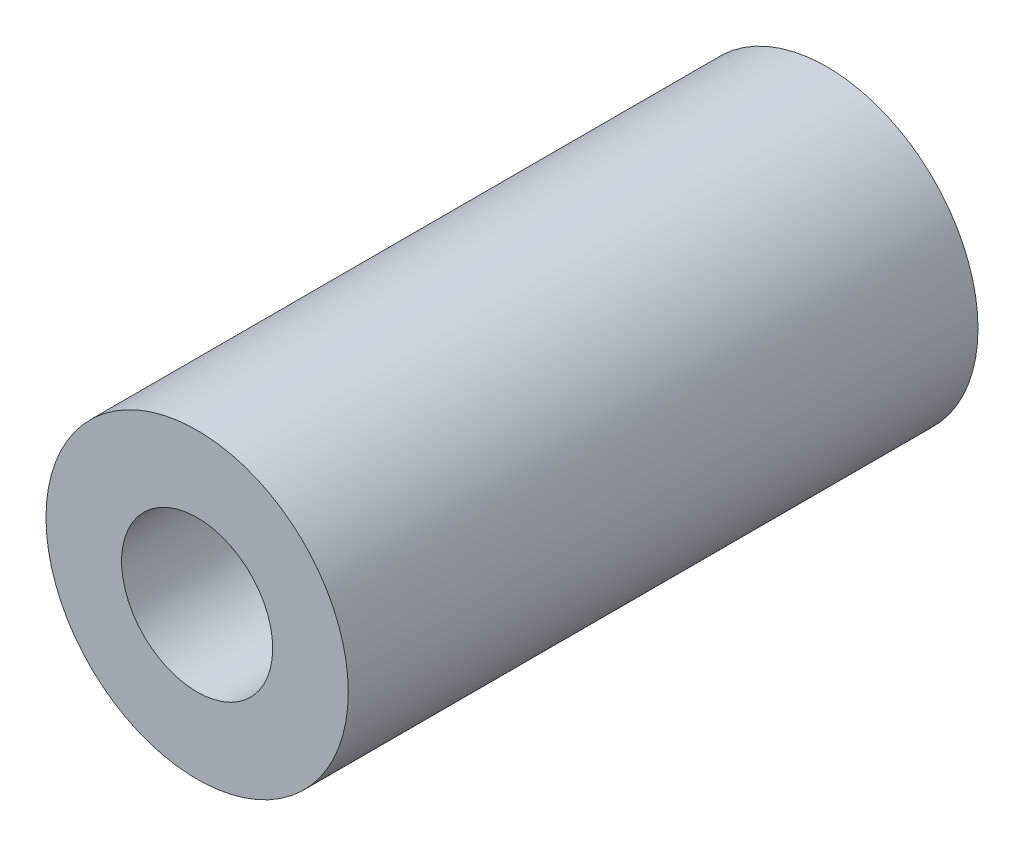
ISO-10303-21;
HEADER;
FILE_DESCRIPTION(('STEP AP214'),'2;1');
FILE_NAME('part.step','',(''),(''),'','','');
FILE_SCHEMA(('AUTOMOTIVE_DESIGN { 1 0 10303 214 1 1 1 1 }'));
ENDSEC;
DATA;
#1=APPLICATION_CONTEXT('core data for automotive mechanical design processes');
#2=APPLICATION_PROTOCOL_DEFINITION('international standard','automotive_design',2000,#1);
#3=PRODUCT_CONTEXT('',#1,'mechanical');
#4=PRODUCT('Part','Part','',(#3));
#5=PRODUCT_RELATED_PRODUCT_CATEGORY('part','',(#4));
#6=PRODUCT_DEFINITION_FORMATION('','',#4);
#7=PRODUCT_DEFINITION_CONTEXT('part definition',#1,'design');
#8=PRODUCT_DEFINITION('design','',#6,#7);
#9=PRODUCT_DEFINITION_SHAPE('','',#8);
#10=(LENGTH_UNIT() NAMED_UNIT(*) SI_UNIT(.MILLI.,.METRE.));
#11=(NAMED_UNIT(*) PLANE_ANGLE_UNIT() SI_UNIT($,.RADIAN.));
#12=(NAMED_UNIT(*) SI_UNIT($,.STERADIAN.) SOLID_ANGLE_UNIT());
#13=UNCERTAINTY_MEASURE_WITH_UNIT(LENGTH_MEASURE(1.E-05),#10,'distance_accuracy_value','');
#14=(GEOMETRIC_REPRESENTATION_CONTEXT(3) GLOBAL_UNCERTAINTY_ASSIGNED_CONTEXT((#13)) GLOBAL_UNIT_ASSIGNED_CONTEXT((#10,
#11,#12)) REPRESENTATION_CONTEXT('',''));
#15=CARTESIAN_POINT('',(0.,0.,0.));
#16=DIRECTION('',(0.,0.,1.));
#17=DIRECTION('',(1.,0.,0.));
#18=AXIS2_PLACEMENT_3D('',#15,#16,#17);
#19=CARTESIAN_POINT('',(0.,0.,25.));
#20=DIRECTION('',(0.,0.,1.));
#21=DIRECTION('',(1.,0.,0.));
#22=AXIS2_PLACEMENT_3D('',#19,#20,#21);
#23=PLANE('',#22);
#24=CARTESIAN_POINT('',(0.,0.,25.));
#25=DIRECTION('',(0.,0.,1.));
#26=DIRECTION('',(1.,0.,0.));
#27=AXIS2_PLACEMENT_3D('',#24,#25,#26);
#28=CIRCLE('',#27,6.);
#29=CARTESIAN_POINT('',(6.,0.,25.));
#30=VERTEX_POINT('',#29);
#31=EDGE_CURVE('E11',#30,#30,#28,.T.);
#32=ORIENTED_EDGE('',*,*,#31,.T.);
#33=EDGE_LOOP('',(#32));
#34=FACE_BOUND('',#33,.T.);
#35=CARTESIAN_POINT('',(0.,0.,25.));
#36=DIRECTION('',(0.,0.,1.));
#37=DIRECTION('',(1.,0.,0.));
#38=AXIS2_PLACEMENT_3D('',#35,#36,#37);
#39=CIRCLE('',#38,3.);
#40=CARTESIAN_POINT('',(3.,0.,25.));
#41=VERTEX_POINT('',#40);
#42=EDGE_CURVE('E48',#41,#41,#39,.T.);
#43=ORIENTED_EDGE('',*,*,#42,.F.);
#44=EDGE_LOOP('',(#43));
#45=FACE_BOUND('',#44,.T.);
#46=ADVANCED_FACE('F37',(#34,#45),#23,.T.);
#47=CARTESIAN_POINT('',(0.,0.,0.));
#48=DIRECTION('',(0.,0.,1.));
#49=DIRECTION('',(1.,0.,0.));
#50=AXIS2_PLACEMENT_3D('',#47,#48,#49);
#51=PLANE('',#50);
#52=CARTESIAN_POINT('',(0.,0.,0.));
#53=DIRECTION('',(0.,0.,1.));
#54=DIRECTION('',(1.,0.,0.));
#55=AXIS2_PLACEMENT_3D('',#52,#53,#54);
#56=CIRCLE('',#55,6.);
#57=CARTESIAN_POINT('',(6.,0.,0.));
#58=VERTEX_POINT('',#57);
#59=EDGE_CURVE('E41',#58,#58,#56,.T.);
#60=ORIENTED_EDGE('',*,*,#59,.F.);
#61=EDGE_LOOP('',(#60));
#62=FACE_BOUND('',#61,.T.);
#63=CARTESIAN_POINT('',(0.,0.,0.));
#64=DIRECTION('',(0.,0.,1.));
#65=DIRECTION('',(1.,0.,0.));
#66=AXIS2_PLACEMENT_3D('',#63,#64,#65);
#67=CIRCLE('',#66,3.);
#68=CARTESIAN_POINT('',(3.,0.,0.));
#69=VERTEX_POINT('',#68);
#70=EDGE_CURVE('E50',#69,#69,#67,.T.);
#71=ORIENTED_EDGE('',*,*,#70,.T.);
#72=EDGE_LOOP('',(#71));
#73=FACE_BOUND('',#72,.T.);
#74=ADVANCED_FACE('F60',(#62,#73),#51,.F.);
#75=CARTESIAN_POINT('',(0.,0.,25.));
#76=DIRECTION('',(0.,0.,-1.));
#77=DIRECTION('',(-1.,0.,0.));
#78=AXIS2_PLACEMENT_3D('',#75,#76,#77);
#79=CYLINDRICAL_SURFACE('',#78,6.);
#80=ORIENTED_EDGE('',*,*,#31,.F.);
#81=EDGE_LOOP('',(#80));
#82=FACE_BOUND('',#81,.T.);
#83=ORIENTED_EDGE('',*,*,#59,.T.);
#84=EDGE_LOOP('',(#83));
#85=FACE_BOUND('',#84,.T.);
#86=ADVANCED_FACE('F39',(#82,#85),#79,.T.);
#87=CARTESIAN_POINT('',(0.,0.,25.));
#88=DIRECTION('',(0.,0.,-1.));
#89=DIRECTION('',(-1.,0.,0.));
#90=AXIS2_PLACEMENT_3D('',#87,#88,#89);
#91=CYLINDRICAL_SURFACE('',#90,3.);
#92=ORIENTED_EDGE('',*,*,#42,.T.);
#93=EDGE_LOOP('',(#92));
#94=FACE_BOUND('',#93,.T.);
#95=ORIENTED_EDGE('',*,*,#70,.F.);
#96=EDGE_LOOP('',(#95));
#97=FACE_BOUND('',#96,.T.);
#98=ADVANCED_FACE('F56',(#94,#97),#91,.F.);
#99=CLOSED_SHELL('',(#46,#74,#86,#98));
#100=MANIFOLD_SOLID_BREP('B2',#99);
#101=ADVANCED_BREP_SHAPE_REPRESENTATION('',(#18,#100),#14);
#102=SHAPE_DEFINITION_REPRESENTATION(#9,#101);
ENDSEC;
END-ISO-10303-21;
